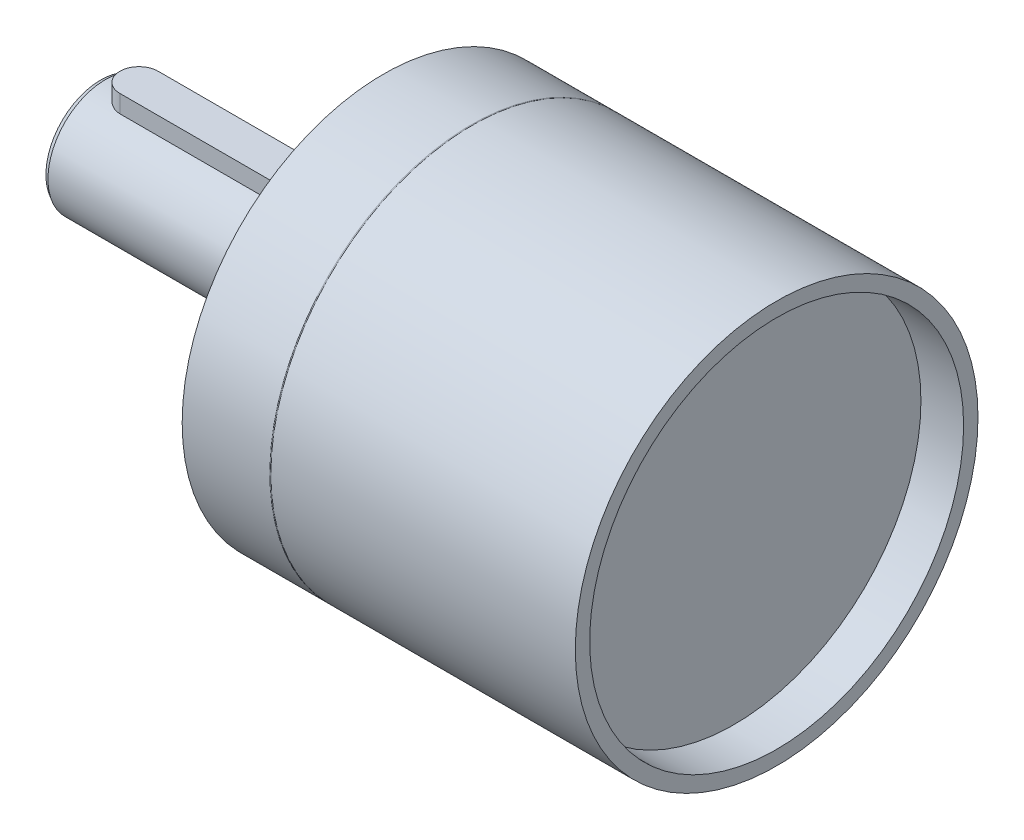
ISO-10303-21;
HEADER;
FILE_DESCRIPTION(('STEP AP214'),'2;1');
FILE_NAME('part.step','',(''),(''),'','','');
FILE_SCHEMA(('AUTOMOTIVE_DESIGN { 1 0 10303 214 1 1 1 1 }'));
ENDSEC;
DATA;
#1=APPLICATION_CONTEXT('core data for automotive mechanical design processes');
#2=APPLICATION_PROTOCOL_DEFINITION('international standard','automotive_design',2000,#1);
#3=PRODUCT_CONTEXT('',#1,'mechanical');
#4=PRODUCT('Part','Part','',(#3));
#5=PRODUCT_RELATED_PRODUCT_CATEGORY('part','',(#4));
#6=PRODUCT_DEFINITION_FORMATION('','',#4);
#7=PRODUCT_DEFINITION_CONTEXT('part definition',#1,'design');
#8=PRODUCT_DEFINITION('design','',#6,#7);
#9=PRODUCT_DEFINITION_SHAPE('','',#8);
#10=(LENGTH_UNIT() NAMED_UNIT(*) SI_UNIT(.MILLI.,.METRE.));
#11=(NAMED_UNIT(*) PLANE_ANGLE_UNIT() SI_UNIT($,.RADIAN.));
#12=(NAMED_UNIT(*) SI_UNIT($,.STERADIAN.) SOLID_ANGLE_UNIT());
#13=UNCERTAINTY_MEASURE_WITH_UNIT(LENGTH_MEASURE(1.E-05),#10,'distance_accuracy_value','');
#14=(GEOMETRIC_REPRESENTATION_CONTEXT(3) GLOBAL_UNCERTAINTY_ASSIGNED_CONTEXT((#13)) GLOBAL_UNIT_ASSIGNED_CONTEXT((#10,
#11,#12)) REPRESENTATION_CONTEXT('',''));
#15=CARTESIAN_POINT('',(0.,0.,0.));
#16=DIRECTION('',(0.,0.,1.));
#17=DIRECTION('',(1.,0.,0.));
#18=AXIS2_PLACEMENT_3D('',#15,#16,#17);
#19=CARTESIAN_POINT('',(-27.560843918252,0.,0.));
#20=DIRECTION('',(-1.,0.,0.));
#21=DIRECTION('',(0.,0.,1.));
#22=AXIS2_PLACEMENT_3D('',#19,#20,#21);
#23=CONICAL_SURFACE('',#22,0.624999999956799,1.04719755117749);
#24=CARTESIAN_POINT('',(-27.56084391824,0.,0.));
#25=DIRECTION('',(-1.,0.,0.));
#26=DIRECTION('',(0.,0.,1.));
#27=AXIS2_PLACEMENT_3D('',#24,#25,#26);
#28=CIRCLE('',#27,0.625);
#29=CARTESIAN_POINT('',(-27.56084391824,0.,0.625));
#30=VERTEX_POINT('',#29);
#31=EDGE_CURVE('E148',#30,#30,#28,.T.);
#32=ORIENTED_EDGE('',*,*,#31,.T.);
#33=EDGE_LOOP('',(#32));
#34=FACE_BOUND('',#33,.T.);
#35=CARTESIAN_POINT('',(-27.2000000000219,5.6843418860808E-11,0.));
#36=VERTEX_POINT('',#35);
#37=VERTEX_LOOP('',#36);
#38=FACE_BOUND('',#37,.T.);
#39=ADVANCED_FACE('F17',(#34,#38),#23,.F.);
#40=CARTESIAN_POINT('',(-27.085,0.,0.));
#41=DIRECTION('',(-1.,0.,0.));
#42=DIRECTION('',(0.,0.,1.));
#43=AXIS2_PLACEMENT_3D('',#40,#41,#42);
#44=CYLINDRICAL_SURFACE('',#43,0.625);
#45=CARTESIAN_POINT('',(-28.2875644346632,0.,0.));
#46=DIRECTION('',(-1.,0.,0.));
#47=DIRECTION('',(0.,1.,0.));
#48=AXIS2_PLACEMENT_3D('',#45,#46,#47);
#49=CIRCLE('',#48,0.625000000013642);
#50=CARTESIAN_POINT('',(-28.2875644346632,0.625000000013642,0.));
#51=VERTEX_POINT('',#50);
#52=EDGE_CURVE('E144',#51,#51,#49,.T.);
#53=ORIENTED_EDGE('',*,*,#52,.T.);
#54=EDGE_LOOP('',(#53));
#55=FACE_BOUND('',#54,.T.);
#56=ORIENTED_EDGE('',*,*,#31,.F.);
#57=EDGE_LOOP('',(#56));
#58=FACE_BOUND('',#57,.T.);
#59=ADVANCED_FACE('F661',(#55,#58),#44,.F.);
#60=CARTESIAN_POINT('',(-29.4999999999845,0.,0.));
#61=DIRECTION('',(-1.,0.,0.));
#62=DIRECTION('',(0.,0.,1.));
#63=AXIS2_PLACEMENT_3D('',#60,#61,#62);
#64=CONICAL_SURFACE('',#63,1.32500000000846,0.523598775586827);
#65=ORIENTED_EDGE('',*,*,#52,.F.);
#66=EDGE_LOOP('',(#65));
#67=FACE_BOUND('',#66,.T.);
#68=CARTESIAN_POINT('',(-29.4999999999845,0.,0.));
#69=DIRECTION('',(-1.,0.,0.));
#70=DIRECTION('',(0.,0.,1.));
#71=AXIS2_PLACEMENT_3D('',#68,#69,#70);
#72=CIRCLE('',#71,1.32500000000846);
#73=CARTESIAN_POINT('',(-29.4999999999845,0.,1.32500000000846));
#74=VERTEX_POINT('',#73);
#75=EDGE_CURVE('E20',#74,#74,#72,.T.);
#76=ORIENTED_EDGE('',*,*,#75,.T.);
#77=EDGE_LOOP('',(#76));
#78=FACE_BOUND('',#77,.T.);
#79=ADVANCED_FACE('F653',(#67,#78),#64,.F.);
#80=CARTESIAN_POINT('',(0.,7.5,0.));
#81=DIRECTION('',(0.,1.,0.));
#82=DIRECTION('',(0.,0.,1.));
#83=AXIS2_PLACEMENT_3D('',#80,#81,#82);
#84=PLANE('',#83);
#85=DIRECTION('',(-1.,0.,0.));
#86=VECTOR('',#85,1.);
#87=CARTESIAN_POINT('',(-9.5,7.5,-2.));
#88=LINE('',#87,#86);
#89=CARTESIAN_POINT('',(-25.5,7.5,-2.));
#90=VERTEX_POINT('',#89);
#91=CARTESIAN_POINT('',(-9.5,7.5,-2.));
#92=VERTEX_POINT('',#91);
#93=EDGE_CURVE('E106',#90,#92,#88,.F.);
#94=ORIENTED_EDGE('',*,*,#93,.F.);
#95=CARTESIAN_POINT('',(-25.5,7.5,0.));
#96=DIRECTION('',(0.,1.,0.));
#97=DIRECTION('',(0.,0.,1.));
#98=AXIS2_PLACEMENT_3D('',#95,#96,#97);
#99=CIRCLE('',#98,2.);
#100=CARTESIAN_POINT('',(-25.5,7.5,2.));
#101=VERTEX_POINT('',#100);
#102=EDGE_CURVE('E124',#101,#90,#99,.F.);
#103=ORIENTED_EDGE('',*,*,#102,.F.);
#104=DIRECTION('',(1.,0.,0.));
#105=VECTOR('',#104,1.);
#106=CARTESIAN_POINT('',(-25.5,7.5,2.));
#107=LINE('',#106,#105);
#108=CARTESIAN_POINT('',(-9.5,7.5,2.));
#109=VERTEX_POINT('',#108);
#110=EDGE_CURVE('E121',#109,#101,#107,.F.);
#111=ORIENTED_EDGE('',*,*,#110,.F.);
#112=CARTESIAN_POINT('',(-9.5,7.5,0.));
#113=DIRECTION('',(0.,1.,0.));
#114=DIRECTION('',(0.,0.,1.));
#115=AXIS2_PLACEMENT_3D('',#112,#113,#114);
#116=CIRCLE('',#115,2.);
#117=EDGE_CURVE('E111',#92,#109,#116,.F.);
#118=ORIENTED_EDGE('',*,*,#117,.F.);
#119=EDGE_LOOP('',(#94,#103,#111,#118));
#120=FACE_BOUND('',#119,.T.);
#121=ADVANCED_FACE('F122',(#120),#84,.T.);
#122=CARTESIAN_POINT('',(-29.5,0.,0.));
#123=DIRECTION('',(1.,0.,0.));
#124=DIRECTION('',(0.,0.,-1.));
#125=AXIS2_PLACEMENT_3D('',#122,#123,#124);
#126=PLANE('',#125);
#127=ORIENTED_EDGE('',*,*,#75,.F.);
#128=EDGE_LOOP('',(#127));
#129=FACE_BOUND('',#128,.T.);
#130=CARTESIAN_POINT('',(-29.4999999999845,0.,0.));
#131=DIRECTION('',(1.,0.,0.));
#132=DIRECTION('',(0.,0.,-1.));
#133=AXIS2_PLACEMENT_3D('',#130,#131,#132);
#134=CIRCLE('',#133,5.71132486546215);
#135=CARTESIAN_POINT('',(-29.4999999999845,0.,-5.71132486546215));
#136=VERTEX_POINT('',#135);
#137=EDGE_CURVE('E340',#136,#136,#134,.T.);
#138=ORIENTED_EDGE('',*,*,#137,.F.);
#139=EDGE_LOOP('',(#138));
#140=FACE_BOUND('',#139,.T.);
#141=ADVANCED_FACE('F637',(#129,#140),#126,.F.);
#142=CARTESIAN_POINT('',(-9.5,0.,-2.));
#143=DIRECTION('',(0.,0.,-1.));
#144=DIRECTION('',(-1.,0.,0.));
#145=AXIS2_PLACEMENT_3D('',#142,#143,#144);
#146=PLANE('',#145);
#147=DIRECTION('',(0.,1.,0.));
#148=VECTOR('',#147,1.);
#149=CARTESIAN_POINT('',(-9.5,0.,-2.));
#150=LINE('',#149,#148);
#151=CARTESIAN_POINT('',(-9.5,5.65685424949236,-2.00000000000003));
#152=VERTEX_POINT('',#151);
#153=EDGE_CURVE('E117',#152,#92,#150,.T.);
#154=ORIENTED_EDGE('',*,*,#153,.F.);
#155=DIRECTION('',(1.,0.,0.));
#156=VECTOR('',#155,1.);
#157=CARTESIAN_POINT('',(-29.50000001223,5.65685424949234,-2.00000000000012));
#158=LINE('',#157,#156);
#159=CARTESIAN_POINT('',(-25.5,5.65685424949236,-2.00000000000006));
#160=VERTEX_POINT('',#159);
#161=EDGE_CURVE('E335',#160,#152,#158,.T.);
#162=ORIENTED_EDGE('',*,*,#161,.F.);
#163=DIRECTION('',(0.,1.,0.));
#164=VECTOR('',#163,1.);
#165=CARTESIAN_POINT('',(-25.5,0.,-2.));
#166=LINE('',#165,#164);
#167=EDGE_CURVE('E346',#90,#160,#166,.F.);
#168=ORIENTED_EDGE('',*,*,#167,.F.);
#169=ORIENTED_EDGE('',*,*,#93,.T.);
#170=EDGE_LOOP('',(#154,#162,#168,#169));
#171=FACE_BOUND('',#170,.T.);
#172=ADVANCED_FACE('F630',(#171),#146,.T.);
#173=CARTESIAN_POINT('',(-9.5,0.,0.));
#174=DIRECTION('',(0.,1.,0.));
#175=DIRECTION('',(0.,0.,1.));
#176=AXIS2_PLACEMENT_3D('',#173,#174,#175);
#177=CYLINDRICAL_SURFACE('',#176,2.);
#178=DIRECTION('',(0.,1.,0.));
#179=VECTOR('',#178,1.);
#180=CARTESIAN_POINT('',(-9.5,0.,2.));
#181=LINE('',#180,#179);
#182=CARTESIAN_POINT('',(-9.5,5.65685424949236,2.00000000000006));
#183=VERTEX_POINT('',#182);
#184=EDGE_CURVE('E115',#183,#109,#181,.T.);
#185=ORIENTED_EDGE('',*,*,#184,.F.);
#186=CARTESIAN_POINT('',(-9.5,5.65685424949238,-2.));
#187=CARTESIAN_POINT('',(-9.44541895672399,5.65684884179147,-2.00000149375843));
#188=CARTESIAN_POINT('',(-9.39086577621134,5.65764520027124,-1.99776424451255));
#189=CARTESIAN_POINT('',(-9.28218263405823,5.66078655296455,-1.98885119435739));
#190=CARTESIAN_POINT('',(-9.22805256216313,5.66313112913611,-1.98217659159679));
#191=CARTESIAN_POINT('',(-9.06721552030273,5.67238186100911,-1.95562129980308));
#192=CARTESIAN_POINT('',(-8.96163821402684,5.68150585996212,-1.92920842248733));
#193=CARTESIAN_POINT('',(-8.75674813455779,5.70456166112212,-1.85991633491415));
#194=CARTESIAN_POINT('',(-8.65743203403455,5.7184908838253,-1.81704595785701));
#195=CARTESIAN_POINT('',(-8.46731769061003,5.74957624122923,-1.71614472563144));
#196=CARTESIAN_POINT('',(-8.37652447504903,5.76673426277569,-1.65810499804511));
#197=CARTESIAN_POINT('',(-8.20256728991935,5.80308799465943,-1.52610884181332));
#198=CARTESIAN_POINT('',(-8.11978479859934,5.8223341977329,-1.45166369414288));
#199=CARTESIAN_POINT('',(-7.96760004309403,5.86027369058979,-1.28999145201007));
#200=CARTESIAN_POINT('',(-7.89820250398592,5.87896678315314,-1.20275986280909));
#201=CARTESIAN_POINT('',(-7.77301185564616,5.91428598942568,-1.01516592788934));
#202=CARTESIAN_POINT('',(-7.71762776817957,5.93084424167128,-0.914516988771548));
#203=CARTESIAN_POINT('',(-7.62477936142906,5.95940326071059,-0.704746567262074));
#204=CARTESIAN_POINT('',(-7.58729305109839,5.97140961667465,-0.595635674808579));
#205=CARTESIAN_POINT('',(-7.53975245896824,5.98683877140557,-0.405040536436655));
#206=CARTESIAN_POINT('',(-7.52487607931098,5.99174657627998,-0.324846609487063));
#207=CARTESIAN_POINT('',(-7.50499841248844,5.99832834221426,-0.163111840880363));
#208=CARTESIAN_POINT('',(-7.49999657718262,6.00000248277623,-0.0815710742403429));
#209=CARTESIAN_POINT('',(-7.50000457598219,5.99999668076367,0.109052789280185));
#210=CARTESIAN_POINT('',(-7.50895512679546,5.99699670684629,0.218159747800598));
#211=CARTESIAN_POINT('',(-7.54443701920154,5.98531165061164,0.433213016519224));
#212=CARTESIAN_POINT('',(-7.57098331309363,5.97662173323895,0.539156558461215));
#213=CARTESIAN_POINT('',(-7.64064090432792,5.95450524812733,0.74466935491201));
#214=CARTESIAN_POINT('',(-7.68371928493169,5.94108809701936,0.84425082015528));
#215=CARTESIAN_POINT('',(-7.78508919594529,5.91088699350149,1.03476127570407));
#216=CARTESIAN_POINT('',(-7.84338193213425,5.89410277426667,1.12568957944319));
#217=CARTESIAN_POINT('',(-7.97564950070831,5.85828241386194,1.2994805717371));
#218=CARTESIAN_POINT('',(-8.05005745949872,5.8391922922297,1.38200242703585));
#219=CARTESIAN_POINT('',(-8.21152992750359,5.80120734240529,1.53366153903484));
#220=CARTESIAN_POINT('',(-8.29859794814308,5.78231256995809,1.60279506987144));
#221=CARTESIAN_POINT('',(-8.48600116281379,5.74626041003989,1.72767175144752));
#222=CARTESIAN_POINT('',(-8.58664859580632,5.72916954418608,1.78296692362324));
#223=CARTESIAN_POINT('',(-8.79643982540843,5.69949629987983,1.87566629037053));
#224=CARTESIAN_POINT('',(-8.90557492499725,5.68690937859231,1.91308852503714));
#225=CARTESIAN_POINT('',(-9.09599725860003,5.67072104665874,1.96044949514537));
#226=CARTESIAN_POINT('',(-9.17597609254467,5.66556318486903,1.97524301676809));
#227=CARTESIAN_POINT('',(-9.3372846305515,5.65861074103288,1.99503214763902));
#228=CARTESIAN_POINT('',(-9.41861445719262,5.6568164658732,2.00002686286613));
#229=CARTESIAN_POINT('',(-9.5,5.65685424949238,2.));
#230=B_SPLINE_CURVE_WITH_KNOTS('',3,(#186,#187,#188,#189,#190,#191,#192,#193,#194,#195,#196,
#197,#198,#199,#200,#201,#202,#203,#204,#205,#206,#207,#208,#209,#210,#211,#212,#213,#214,#215,
#216,#217,#218,#219,#220,#221,#222,#223,#224,#225,#226,#227,#228,#229),.UNSPECIFIED.,.F.,.F.,(4,
2,2,2,2,2,2,2,2,2,2,2,2,2,2,2,2,2,2,2,2,4),(0.,0.16363711848162,0.327230070545713,
0.653162397592184,0.97892003167861,1.30486862655436,1.64230066113897,1.9798515968479,
2.32634313894962,2.67240784330359,2.91690557900246,3.16138974213691,3.48824187903641,
3.81537212111244,4.14185437137159,4.46836250409951,4.80507367423102,5.14187841415668,
5.48847983044704,5.83473066046781,6.07859129287806,6.32247417355028),.UNSPECIFIED.);
#231=EDGE_CURVE('E239',#152,#183,#230,.T.);
#232=ORIENTED_EDGE('',*,*,#231,.F.);
#233=ORIENTED_EDGE('',*,*,#153,.T.);
#234=ORIENTED_EDGE('',*,*,#117,.T.);
#235=EDGE_LOOP('',(#185,#232,#233,#234));
#236=FACE_BOUND('',#235,.T.);
#237=ADVANCED_FACE('F113',(#236),#177,.T.);
#238=CARTESIAN_POINT('',(-25.5,0.,2.));
#239=DIRECTION('',(0.,0.,1.));
#240=DIRECTION('',(1.,0.,0.));
#241=AXIS2_PLACEMENT_3D('',#238,#239,#240);
#242=PLANE('',#241);
#243=DIRECTION('',(0.,1.,0.));
#244=VECTOR('',#243,1.);
#245=CARTESIAN_POINT('',(-25.5,0.,2.));
#246=LINE('',#245,#244);
#247=CARTESIAN_POINT('',(-25.5,5.65685424949236,2.00000000000003));
#248=VERTEX_POINT('',#247);
#249=EDGE_CURVE('E128',#248,#101,#246,.T.);
#250=ORIENTED_EDGE('',*,*,#249,.F.);
#251=DIRECTION('',(1.,0.,0.));
#252=VECTOR('',#251,1.);
#253=CARTESIAN_POINT('',(-29.50000001223,5.65685424949234,2.00000000000012));
#254=LINE('',#253,#252);
#255=EDGE_CURVE('E132',#183,#248,#254,.F.);
#256=ORIENTED_EDGE('',*,*,#255,.F.);
#257=ORIENTED_EDGE('',*,*,#184,.T.);
#258=ORIENTED_EDGE('',*,*,#110,.T.);
#259=EDGE_LOOP('',(#250,#256,#257,#258));
#260=FACE_BOUND('',#259,.T.);
#261=ADVANCED_FACE('F130',(#260),#242,.T.);
#262=CARTESIAN_POINT('',(-25.5,0.,0.));
#263=DIRECTION('',(0.,1.,0.));
#264=DIRECTION('',(0.,0.,1.));
#265=AXIS2_PLACEMENT_3D('',#262,#263,#264);
#266=CYLINDRICAL_SURFACE('',#265,2.);
#267=ORIENTED_EDGE('',*,*,#167,.T.);
#268=CARTESIAN_POINT('',(-25.5,5.65685424949238,2.));
#269=CARTESIAN_POINT('',(-25.554581043276,5.65684884179147,2.00000149375843));
#270=CARTESIAN_POINT('',(-25.6091342237887,5.65764520027124,1.99776424451255));
#271=CARTESIAN_POINT('',(-25.7178173659418,5.66078655296455,1.98885119435739));
#272=CARTESIAN_POINT('',(-25.7719474378369,5.66313112913611,1.98217659159679));
#273=CARTESIAN_POINT('',(-25.9327844796973,5.67238186100911,1.95562129980308));
#274=CARTESIAN_POINT('',(-26.0383617859732,5.68150585996212,1.92920842248733));
#275=CARTESIAN_POINT('',(-26.2432518654422,5.70456166112212,1.85991633491415));
#276=CARTESIAN_POINT('',(-26.3425679659655,5.7184908838253,1.81704595785701));
#277=CARTESIAN_POINT('',(-26.53268230939,5.74957624122923,1.71614472563143));
#278=CARTESIAN_POINT('',(-26.623475524951,5.76673426277569,1.65810499804511));
#279=CARTESIAN_POINT('',(-26.7974327100807,5.80308799465944,1.52610884181332));
#280=CARTESIAN_POINT('',(-26.8802152014007,5.8223341977329,1.45166369414288));
#281=CARTESIAN_POINT('',(-27.032399956906,5.86027369058979,1.28999145201007));
#282=CARTESIAN_POINT('',(-27.1017974960141,5.87896678315314,1.20275986280909));
#283=CARTESIAN_POINT('',(-27.2269881443538,5.91428598942568,1.01516592788933));
#284=CARTESIAN_POINT('',(-27.2823722318204,5.93084424167127,0.914516988771545));
#285=CARTESIAN_POINT('',(-27.3752206385709,5.95940326071059,0.70474656726207));
#286=CARTESIAN_POINT('',(-27.4127069489016,5.97140961667465,0.595635674808576));
#287=CARTESIAN_POINT('',(-27.4602475410318,5.98683877140557,0.405040536436653));
#288=CARTESIAN_POINT('',(-27.475123920689,5.99174657627998,0.32484660948706));
#289=CARTESIAN_POINT('',(-27.4950015875116,5.99832834221426,0.163111840880361));
#290=CARTESIAN_POINT('',(-27.5000034228174,6.00000248277623,0.0815710742403417));
#291=CARTESIAN_POINT('',(-27.4999954240178,5.99999668076367,-0.109052789280186));
#292=CARTESIAN_POINT('',(-27.4910448732045,5.99699670684629,-0.218159747800598));
#293=CARTESIAN_POINT('',(-27.4555629807985,5.98531165061164,-0.433213016519224));
#294=CARTESIAN_POINT('',(-27.4290166869064,5.97662173323895,-0.539156558461215));
#295=CARTESIAN_POINT('',(-27.3593590956721,5.95450524812733,-0.74466935491201));
#296=CARTESIAN_POINT('',(-27.3162807150683,5.94108809701936,-0.844250820155281));
#297=CARTESIAN_POINT('',(-27.2149108040547,5.91088699350149,-1.03476127570407));
#298=CARTESIAN_POINT('',(-27.1566180678657,5.89410277426667,-1.12568957944319));
#299=CARTESIAN_POINT('',(-27.0243504992917,5.85828241386194,-1.2994805717371));
#300=CARTESIAN_POINT('',(-26.9499425405013,5.8391922922297,-1.38200242703585));
#301=CARTESIAN_POINT('',(-26.7884700724964,5.80120734240529,-1.53366153903484));
#302=CARTESIAN_POINT('',(-26.7014020518569,5.78231256995809,-1.60279506987144));
#303=CARTESIAN_POINT('',(-26.5139988371862,5.74626041003989,-1.72767175144752));
#304=CARTESIAN_POINT('',(-26.4133514041937,5.72916954418608,-1.78296692362324));
#305=CARTESIAN_POINT('',(-26.2035601745916,5.69949629987983,-1.87566629037053));
#306=CARTESIAN_POINT('',(-26.0944250750028,5.68690937859231,-1.91308852503714));
#307=CARTESIAN_POINT('',(-25.9040027414,5.67072104665874,-1.96044949514537));
#308=CARTESIAN_POINT('',(-25.8240239074553,5.66556318486903,-1.97524301676809));
#309=CARTESIAN_POINT('',(-25.6627153694485,5.65861074103288,-1.99503214763902));
#310=CARTESIAN_POINT('',(-25.5813855428074,5.6568164658732,-2.00002686286613));
#311=CARTESIAN_POINT('',(-25.5,5.65685424949238,-2.));
#312=B_SPLINE_CURVE_WITH_KNOTS('',3,(#268,#269,#270,#271,#272,#273,#274,#275,#276,#277,#278,
#279,#280,#281,#282,#283,#284,#285,#286,#287,#288,#289,#290,#291,#292,#293,#294,#295,#296,#297,
#298,#299,#300,#301,#302,#303,#304,#305,#306,#307,#308,#309,#310,#311),.UNSPECIFIED.,.F.,.F.,(4,
2,2,2,2,2,2,2,2,2,2,2,2,2,2,2,2,2,2,2,2,4),(0.,0.16363711848162,0.327230070545711,
0.653162397592184,0.978920031678615,1.30486862655436,1.64230066113898,1.9798515968479,
2.32634313894963,2.67240784330359,2.91690557900246,3.16138974213691,3.4882418790364,
3.81537212111244,4.14185437137159,4.46836250409951,4.80507367423102,5.14187841415668,
5.48847983044704,5.83473066046781,6.07859129287806,6.32247417355027),.UNSPECIFIED.);
#313=EDGE_CURVE('E230',#248,#160,#312,.T.);
#314=ORIENTED_EDGE('',*,*,#313,.F.);
#315=ORIENTED_EDGE('',*,*,#249,.T.);
#316=ORIENTED_EDGE('',*,*,#102,.T.);
#317=EDGE_LOOP('',(#267,#314,#315,#316));
#318=FACE_BOUND('',#317,.T.);
#319=ADVANCED_FACE('F245',(#318),#266,.T.);
#320=CARTESIAN_POINT('',(-29.0000000002237,0.,0.));
#321=DIRECTION('',(1.,0.,0.));
#322=DIRECTION('',(0.,0.,-1.));
#323=AXIS2_PLACEMENT_3D('',#320,#321,#322);
#324=CONICAL_SURFACE('',#323,5.99999999991496,0.523598775592442);
#325=CARTESIAN_POINT('',(-29.,0.,0.));
#326=DIRECTION('',(1.,0.,0.));
#327=DIRECTION('',(0.,0.,-1.));
#328=AXIS2_PLACEMENT_3D('',#325,#326,#327);
#329=CIRCLE('',#328,6.);
#330=CARTESIAN_POINT('',(-29.,0.,-6.));
#331=VERTEX_POINT('',#330);
#332=EDGE_CURVE('E238',#331,#331,#329,.T.);
#333=ORIENTED_EDGE('',*,*,#332,.F.);
#334=EDGE_LOOP('',(#333));
#335=FACE_BOUND('',#334,.T.);
#336=ORIENTED_EDGE('',*,*,#137,.T.);
#337=EDGE_LOOP('',(#336));
#338=FACE_BOUND('',#337,.T.);
#339=ADVANCED_FACE('F254',(#335,#338),#324,.T.);
#340=CARTESIAN_POINT('',(-29.50000001223,0.,0.));
#341=DIRECTION('',(1.,0.,0.));
#342=DIRECTION('',(0.,0.,-1.));
#343=AXIS2_PLACEMENT_3D('',#340,#341,#342);
#344=CYLINDRICAL_SURFACE('',#343,6.);
#345=DIRECTION('',(1.,0.,0.));
#346=VECTOR('',#345,1.);
#347=CARTESIAN_POINT('',(-29.50000001223,-5.99279677762809,-0.293916284085002));
#348=LINE('',#347,#346);
#349=CARTESIAN_POINT('',(-4.,-5.99279677762809,-0.293916284085001));
#350=VERTEX_POINT('',#349);
#351=CARTESIAN_POINT('',(-3.,-5.99279677762809,-0.293916284085001));
#352=VERTEX_POINT('',#351);
#353=EDGE_CURVE('E339',#350,#352,#348,.T.);
#354=ORIENTED_EDGE('',*,*,#353,.T.);
#355=CARTESIAN_POINT('',(-3.,0.,0.));
#356=DIRECTION('',(1.,0.,0.));
#357=DIRECTION('',(0.,0.,-1.));
#358=AXIS2_PLACEMENT_3D('',#355,#356,#357);
#359=CIRCLE('',#358,6.);
#360=CARTESIAN_POINT('',(-3.,-5.99279677762809,0.293916284085002));
#361=VERTEX_POINT('',#360);
#362=EDGE_CURVE('E334',#352,#361,#359,.F.);
#363=ORIENTED_EDGE('',*,*,#362,.T.);
#364=DIRECTION('',(1.,0.,0.));
#365=VECTOR('',#364,1.);
#366=CARTESIAN_POINT('',(-29.50000001223,-5.99279677762809,0.293916284085004));
#367=LINE('',#366,#365);
#368=CARTESIAN_POINT('',(-4.,-5.99279677762809,0.293916284085002));
#369=VERTEX_POINT('',#368);
#370=EDGE_CURVE('E331',#361,#369,#367,.F.);
#371=ORIENTED_EDGE('',*,*,#370,.T.);
#372=CARTESIAN_POINT('',(-4.,0.,0.));
#373=DIRECTION('',(1.,0.,0.));
#374=DIRECTION('',(0.,0.,-1.));
#375=AXIS2_PLACEMENT_3D('',#372,#373,#374);
#376=CIRCLE('',#375,6.);
#377=EDGE_CURVE('E225',#350,#369,#376,.T.);
#378=ORIENTED_EDGE('',*,*,#377,.F.);
#379=EDGE_LOOP('',(#354,#363,#371,#378));
#380=FACE_BOUND('',#379,.T.);
#381=ORIENTED_EDGE('',*,*,#161,.T.);
#382=ORIENTED_EDGE('',*,*,#231,.T.);
#383=ORIENTED_EDGE('',*,*,#255,.T.);
#384=ORIENTED_EDGE('',*,*,#313,.T.);
#385=EDGE_LOOP('',(#381,#382,#383,#384));
#386=FACE_BOUND('',#385,.T.);
#387=ORIENTED_EDGE('',*,*,#332,.T.);
#388=EDGE_LOOP('',(#387));
#389=FACE_BOUND('',#388,.T.);
#390=ADVANCED_FACE('F249',(#380,#386,#389),#344,.T.);
#391=CARTESIAN_POINT('',(-4.,0.,0.));
#392=DIRECTION('',(-1.,0.,0.));
#393=DIRECTION('',(0.,0.,1.));
#394=AXIS2_PLACEMENT_3D('',#391,#392,#393);
#395=PLANE('',#394);
#396=DIRECTION('',(0.,1.,0.));
#397=VECTOR('',#396,1.);
#398=CARTESIAN_POINT('',(-4.,0.,-0.293916284085));
#399=LINE('',#398,#397);
#400=CARTESIAN_POINT('',(-4.,-7.61683878137722,-0.293916284085));
#401=VERTEX_POINT('',#400);
#402=EDGE_CURVE('E229',#401,#350,#399,.T.);
#403=ORIENTED_EDGE('',*,*,#402,.T.);
#404=ORIENTED_EDGE('',*,*,#377,.T.);
#405=DIRECTION('',(0.,1.,0.));
#406=VECTOR('',#405,1.);
#407=CARTESIAN_POINT('',(-4.,-5.992796777628,0.293916284085));
#408=LINE('',#407,#406);
#409=CARTESIAN_POINT('',(-4.,-7.616838781378,0.293916284085));
#410=VERTEX_POINT('',#409);
#411=EDGE_CURVE('E224',#410,#369,#408,.T.);
#412=ORIENTED_EDGE('',*,*,#411,.F.);
#413=CARTESIAN_POINT('',(-4.,-4.741805259079,0.293916284085));
#414=DIRECTION('',(-1.,0.,0.));
#415=DIRECTION('',(0.,0.,1.));
#416=AXIS2_PLACEMENT_3D('',#413,#414,#415);
#417=CIRCLE('',#416,2.875033522299);
#418=CARTESIAN_POINT('',(-4.,-5.99279677762795,2.8825139690992));
#419=VERTEX_POINT('',#418);
#420=EDGE_CURVE('E220',#419,#410,#417,.F.);
#421=ORIENTED_EDGE('',*,*,#420,.F.);
#422=CARTESIAN_POINT('',(-4.,0.,0.));
#423=DIRECTION('',(-1.,0.,0.));
#424=DIRECTION('',(0.,0.,1.));
#425=AXIS2_PLACEMENT_3D('',#422,#423,#424);
#426=CIRCLE('',#425,6.65);
#427=CARTESIAN_POINT('',(-4.,-5.99279677762801,-2.88251396909922));
#428=VERTEX_POINT('',#427);
#429=EDGE_CURVE('E215',#428,#419,#426,.F.);
#430=ORIENTED_EDGE('',*,*,#429,.F.);
#431=CARTESIAN_POINT('',(-4.,-3.804845487331,0.293916284085));
#432=DIRECTION('',(-1.,0.,0.));
#433=DIRECTION('',(0.,0.,1.));
#434=AXIS2_PLACEMENT_3D('',#431,#432,#433);
#435=CIRCLE('',#434,3.857050686996);
#436=EDGE_CURVE('E209',#401,#428,#435,.F.);
#437=ORIENTED_EDGE('',*,*,#436,.F.);
#438=EDGE_LOOP('',(#403,#404,#412,#421,#430,#437));
#439=FACE_BOUND('',#438,.T.);
#440=ADVANCED_FACE('F253',(#439),#395,.T.);
#441=CARTESIAN_POINT('',(-3.,-5.992796777628,0.293916284085));
#442=DIRECTION('',(0.,0.,-1.));
#443=DIRECTION('',(-1.,0.,0.));
#444=AXIS2_PLACEMENT_3D('',#441,#442,#443);
#445=PLANE('',#444);
#446=ORIENTED_EDGE('',*,*,#370,.F.);
#447=DIRECTION('',(0.,1.,0.));
#448=VECTOR('',#447,1.);
#449=CARTESIAN_POINT('',(-3.,0.,0.293916284085));
#450=LINE('',#449,#448);
#451=CARTESIAN_POINT('',(-3.,-7.616838781378,0.293916284085));
#452=VERTEX_POINT('',#451);
#453=EDGE_CURVE('E208',#361,#452,#450,.F.);
#454=ORIENTED_EDGE('',*,*,#453,.T.);
#455=DIRECTION('',(-1.,0.,0.));
#456=VECTOR('',#455,1.);
#457=CARTESIAN_POINT('',(-3.,-7.616838781378,0.293916284084999));
#458=LINE('',#457,#456);
#459=EDGE_CURVE('E219',#410,#452,#458,.F.);
#460=ORIENTED_EDGE('',*,*,#459,.F.);
#461=ORIENTED_EDGE('',*,*,#411,.T.);
#462=EDGE_LOOP('',(#446,#454,#460,#461));
#463=FACE_BOUND('',#462,.T.);
#464=ADVANCED_FACE('F383',(#463),#445,.T.);
#465=CARTESIAN_POINT('',(-3.,-4.741805259079,0.293916284085));
#466=DIRECTION('',(-1.,0.,0.));
#467=DIRECTION('',(0.,0.,1.));
#468=AXIS2_PLACEMENT_3D('',#465,#466,#467);
#469=CYLINDRICAL_SURFACE('',#468,2.875033522299);
#470=ORIENTED_EDGE('',*,*,#459,.T.);
#471=CARTESIAN_POINT('',(-3.,-4.741805259079,0.293916284085));
#472=DIRECTION('',(-1.,0.,0.));
#473=DIRECTION('',(0.,0.,1.));
#474=AXIS2_PLACEMENT_3D('',#471,#472,#473);
#475=CIRCLE('',#474,2.875033522299);
#476=CARTESIAN_POINT('',(-3.,-5.99279677762795,2.8825139690992));
#477=VERTEX_POINT('',#476);
#478=EDGE_CURVE('E205',#452,#477,#475,.T.);
#479=ORIENTED_EDGE('',*,*,#478,.T.);
#480=DIRECTION('',(-1.,0.,0.));
#481=VECTOR('',#480,1.);
#482=CARTESIAN_POINT('',(-3.,-5.99279677762804,2.88251396909902));
#483=LINE('',#482,#481);
#484=EDGE_CURVE('E214',#419,#477,#483,.F.);
#485=ORIENTED_EDGE('',*,*,#484,.F.);
#486=ORIENTED_EDGE('',*,*,#420,.T.);
#487=EDGE_LOOP('',(#470,#479,#485,#486));
#488=FACE_BOUND('',#487,.T.);
#489=ADVANCED_FACE('F380',(#488),#469,.T.);
#490=CARTESIAN_POINT('',(-3.,0.,0.));
#491=DIRECTION('',(-1.,0.,0.));
#492=DIRECTION('',(0.,0.,1.));
#493=AXIS2_PLACEMENT_3D('',#490,#491,#492);
#494=CYLINDRICAL_SURFACE('',#493,6.65);
#495=ORIENTED_EDGE('',*,*,#484,.T.);
#496=CARTESIAN_POINT('',(-3.,0.,0.));
#497=DIRECTION('',(-1.,0.,0.));
#498=DIRECTION('',(0.,0.,1.));
#499=AXIS2_PLACEMENT_3D('',#496,#497,#498);
#500=CIRCLE('',#499,6.65);
#501=CARTESIAN_POINT('',(-3.,-5.99279677762801,-2.88251396909922));
#502=VERTEX_POINT('',#501);
#503=EDGE_CURVE('E202',#477,#502,#500,.T.);
#504=ORIENTED_EDGE('',*,*,#503,.T.);
#505=DIRECTION('',(-1.,0.,0.));
#506=VECTOR('',#505,1.);
#507=CARTESIAN_POINT('',(-3.,-5.99279677762811,-2.88251396909915));
#508=LINE('',#507,#506);
#509=EDGE_CURVE('E213',#428,#502,#508,.F.);
#510=ORIENTED_EDGE('',*,*,#509,.F.);
#511=ORIENTED_EDGE('',*,*,#429,.T.);
#512=EDGE_LOOP('',(#495,#504,#510,#511));
#513=FACE_BOUND('',#512,.T.);
#514=ADVANCED_FACE('F377',(#513),#494,.T.);
#515=CARTESIAN_POINT('',(-3.,-3.804845487331,0.293916284085));
#516=DIRECTION('',(-1.,0.,0.));
#517=DIRECTION('',(0.,0.,1.));
#518=AXIS2_PLACEMENT_3D('',#515,#516,#517);
#519=CYLINDRICAL_SURFACE('',#518,3.857050686996);
#520=ORIENTED_EDGE('',*,*,#509,.T.);
#521=CARTESIAN_POINT('',(-3.,-3.804845487331,0.293916284085));
#522=DIRECTION('',(-1.,0.,0.));
#523=DIRECTION('',(0.,0.,1.));
#524=AXIS2_PLACEMENT_3D('',#521,#522,#523);
#525=CIRCLE('',#524,3.857050686996);
#526=CARTESIAN_POINT('',(-3.,-7.61683878137722,-0.293916284085));
#527=VERTEX_POINT('',#526);
#528=EDGE_CURVE('E199',#502,#527,#525,.T.);
#529=ORIENTED_EDGE('',*,*,#528,.T.);
#530=DIRECTION('',(1.,0.,0.));
#531=VECTOR('',#530,1.);
#532=CARTESIAN_POINT('',(-3.,-7.616838781377,-0.293916284085));
#533=LINE('',#532,#531);
#534=EDGE_CURVE('E310',#401,#527,#533,.T.);
#535=ORIENTED_EDGE('',*,*,#534,.F.);
#536=ORIENTED_EDGE('',*,*,#436,.T.);
#537=EDGE_LOOP('',(#520,#529,#535,#536));
#538=FACE_BOUND('',#537,.T.);
#539=ADVANCED_FACE('F373',(#538),#519,.T.);
#540=CARTESIAN_POINT('',(-3.,-7.616838781377,-0.293916284085));
#541=DIRECTION('',(0.,0.,1.));
#542=DIRECTION('',(1.,0.,0.));
#543=AXIS2_PLACEMENT_3D('',#540,#541,#542);
#544=PLANE('',#543);
#545=ORIENTED_EDGE('',*,*,#534,.T.);
#546=DIRECTION('',(0.,1.,0.));
#547=VECTOR('',#546,1.);
#548=CARTESIAN_POINT('',(-3.,0.,-0.293916284085));
#549=LINE('',#548,#547);
#550=EDGE_CURVE('E198',#527,#352,#549,.T.);
#551=ORIENTED_EDGE('',*,*,#550,.T.);
#552=ORIENTED_EDGE('',*,*,#353,.F.);
#553=ORIENTED_EDGE('',*,*,#402,.F.);
#554=EDGE_LOOP('',(#545,#551,#552,#553));
#555=FACE_BOUND('',#554,.T.);
#556=ADVANCED_FACE('F369',(#555),#544,.T.);
#557=CARTESIAN_POINT('',(-3.,0.,0.));
#558=DIRECTION('',(1.,0.,0.));
#559=DIRECTION('',(0.,0.,-1.));
#560=AXIS2_PLACEMENT_3D('',#557,#558,#559);
#561=PLANE('',#560);
#562=ORIENTED_EDGE('',*,*,#362,.F.);
#563=ORIENTED_EDGE('',*,*,#550,.F.);
#564=ORIENTED_EDGE('',*,*,#528,.F.);
#565=ORIENTED_EDGE('',*,*,#503,.F.);
#566=ORIENTED_EDGE('',*,*,#478,.F.);
#567=ORIENTED_EDGE('',*,*,#453,.F.);
#568=EDGE_LOOP('',(#562,#563,#564,#565,#566,#567));
#569=FACE_BOUND('',#568,.T.);
#570=CARTESIAN_POINT('',(-3.,0.,0.));
#571=DIRECTION('',(1.,0.,0.));
#572=DIRECTION('',(0.,0.,-1.));
#573=AXIS2_PLACEMENT_3D('',#570,#571,#572);
#574=CIRCLE('',#573,14.);
#575=CARTESIAN_POINT('',(-3.,0.,-14.));
#576=VERTEX_POINT('',#575);
#577=EDGE_CURVE('E193',#576,#576,#574,.T.);
#578=ORIENTED_EDGE('',*,*,#577,.F.);
#579=EDGE_LOOP('',(#578));
#580=FACE_BOUND('',#579,.T.);
#581=ADVANCED_FACE('F364',(#569,#580),#561,.F.);
#582=CARTESIAN_POINT('',(5.99999999997181,17.49999999997,3.054326190989E-05));
#583=DIRECTION('',(-1.,0.,0.));
#584=DIRECTION('',(0.,0.,1.));
#585=AXIS2_PLACEMENT_3D('',#582,#583,#584);
#586=CONICAL_SURFACE('',#585,1.6499999999978,1.02974425866086);
#587=CARTESIAN_POINT('',(6.,17.49999999997,3.054326190989E-05));
#588=DIRECTION('',(-1.,0.,0.));
#589=DIRECTION('',(0.,0.,1.));
#590=AXIS2_PLACEMENT_3D('',#587,#588,#589);
#591=CIRCLE('',#590,1.65);
#592=CARTESIAN_POINT('',(6.,17.49999999997,1.65003054326191));
#593=VERTEX_POINT('',#592);
#594=EDGE_CURVE('E197',#593,#593,#591,.T.);
#595=ORIENTED_EDGE('',*,*,#594,.T.);
#596=EDGE_LOOP('',(#595));
#597=FACE_BOUND('',#596,.T.);
#598=CARTESIAN_POINT('',(6.99142002136455,17.5000000000125,3.054326190989E-05));
#599=VERTEX_POINT('',#598);
#600=VERTEX_LOOP('',#599);
#601=FACE_BOUND('',#600,.T.);
#602=ADVANCED_FACE('F402',(#597,#601),#586,.F.);
#603=CARTESIAN_POINT('',(5.99999999997181,-3.054326190881E-05,17.49999999997));
#604=DIRECTION('',(-1.,0.,0.));
#605=DIRECTION('',(0.,0.,1.));
#606=AXIS2_PLACEMENT_3D('',#603,#604,#605);
#607=CONICAL_SURFACE('',#606,1.6499999999978,1.02974425866086);
#608=CARTESIAN_POINT('',(6.,-3.054326190881E-05,17.49999999997));
#609=DIRECTION('',(-1.,0.,0.));
#610=DIRECTION('',(0.,0.,1.));
#611=AXIS2_PLACEMENT_3D('',#608,#609,#610);
#612=CIRCLE('',#611,1.65);
#613=CARTESIAN_POINT('',(6.,-3.054326190881E-05,19.14999999997));
#614=VERTEX_POINT('',#613);
#615=EDGE_CURVE('E298',#614,#614,#612,.T.);
#616=ORIENTED_EDGE('',*,*,#615,.T.);
#617=EDGE_LOOP('',(#616));
#618=FACE_BOUND('',#617,.T.);
#619=CARTESIAN_POINT('',(6.99142002136455,-3.054326190881E-05,17.5000000000125));
#620=VERTEX_POINT('',#619);
#621=VERTEX_LOOP('',#620);
#622=FACE_BOUND('',#621,.T.);
#623=ADVANCED_FACE('F405',(#618,#622),#607,.F.);
#624=CARTESIAN_POINT('',(5.99999999997181,-17.49999999997,-3.054326190774E-05));
#625=DIRECTION('',(-1.,0.,0.));
#626=DIRECTION('',(0.,0.,1.));
#627=AXIS2_PLACEMENT_3D('',#624,#625,#626);
#628=CONICAL_SURFACE('',#627,1.6499999999978,1.02974425866086);
#629=CARTESIAN_POINT('',(6.,-17.49999999997,-3.054326190774E-05));
#630=DIRECTION('',(-1.,0.,0.));
#631=DIRECTION('',(0.,0.,1.));
#632=AXIS2_PLACEMENT_3D('',#629,#630,#631);
#633=CIRCLE('',#632,1.65);
#634=CARTESIAN_POINT('',(6.,-17.49999999997,1.64996945673809));
#635=VERTEX_POINT('',#634);
#636=EDGE_CURVE('E294',#635,#635,#633,.T.);
#637=ORIENTED_EDGE('',*,*,#636,.T.);
#638=EDGE_LOOP('',(#637));
#639=FACE_BOUND('',#638,.T.);
#640=CARTESIAN_POINT('',(6.99142002136455,-17.5000000000125,-3.054326190774E-05));
#641=VERTEX_POINT('',#640);
#642=VERTEX_LOOP('',#641);
#643=FACE_BOUND('',#642,.T.);
#644=ADVANCED_FACE('F409',(#639,#643),#628,.F.);
#645=CARTESIAN_POINT('',(5.99999999997181,3.054326190667E-05,-17.49999999997));
#646=DIRECTION('',(-1.,0.,0.));
#647=DIRECTION('',(0.,0.,1.));
#648=AXIS2_PLACEMENT_3D('',#645,#646,#647);
#649=CONICAL_SURFACE('',#648,1.6499999999978,1.02974425866086);
#650=CARTESIAN_POINT('',(6.,3.054326190667E-05,-17.49999999997));
#651=DIRECTION('',(-1.,0.,0.));
#652=DIRECTION('',(0.,0.,1.));
#653=AXIS2_PLACEMENT_3D('',#650,#651,#652);
#654=CIRCLE('',#653,1.65);
#655=CARTESIAN_POINT('',(6.,3.054326190667E-05,-15.84999999997));
#656=VERTEX_POINT('',#655);
#657=EDGE_CURVE('E290',#656,#656,#654,.T.);
#658=ORIENTED_EDGE('',*,*,#657,.T.);
#659=EDGE_LOOP('',(#658));
#660=FACE_BOUND('',#659,.T.);
#661=CARTESIAN_POINT('',(6.99142002136455,3.054326190667E-05,-17.5000000000125));
#662=VERTEX_POINT('',#661);
#663=VERTEX_LOOP('',#662);
#664=FACE_BOUND('',#663,.T.);
#665=ADVANCED_FACE('F413',(#660,#664),#649,.F.);
#666=CARTESIAN_POINT('',(2.00000000012324,18.01565088397,-7.462326931119));
#667=DIRECTION('',(-1.,0.,0.));
#668=DIRECTION('',(0.,0.,1.));
#669=AXIS2_PLACEMENT_3D('',#666,#667,#668);
#670=CONICAL_SURFACE('',#669,0.749999999922705,1.02974425868404);
#671=CARTESIAN_POINT('',(2.,18.01565088397,-7.462326931119));
#672=DIRECTION('',(-1.,0.,0.));
#673=DIRECTION('',(0.,0.,1.));
#674=AXIS2_PLACEMENT_3D('',#671,#672,#673);
#675=CIRCLE('',#674,0.75);
#676=CARTESIAN_POINT('',(2.,18.01565088397,-6.712326931119));
#677=VERTEX_POINT('',#676);
#678=EDGE_CURVE('E192',#677,#677,#675,.T.);
#679=ORIENTED_EDGE('',*,*,#678,.T.);
#680=EDGE_LOOP('',(#679));
#681=FACE_BOUND('',#680,.T.);
#682=CARTESIAN_POINT('',(2.45064546433582,18.0156508840241,-7.462326931119));
#683=VERTEX_POINT('',#682);
#684=VERTEX_LOOP('',#683);
#685=FACE_BOUND('',#684,.T.);
#686=ADVANCED_FACE('F417',(#681,#685),#670,.F.);
#687=CARTESIAN_POINT('',(-29.50000001223,0.,0.));
#688=DIRECTION('',(1.,0.,0.));
#689=DIRECTION('',(0.,0.,-1.));
#690=AXIS2_PLACEMENT_3D('',#687,#688,#689);
#691=CYLINDRICAL_SURFACE('',#690,14.);
#692=ORIENTED_EDGE('',*,*,#577,.T.);
#693=EDGE_LOOP('',(#692));
#694=FACE_BOUND('',#693,.T.);
#695=CARTESIAN_POINT('',(0.,0.,0.));
#696=DIRECTION('',(1.,0.,0.));
#697=DIRECTION('',(0.,0.,-1.));
#698=AXIS2_PLACEMENT_3D('',#695,#696,#697);
#699=CIRCLE('',#698,14.);
#700=CARTESIAN_POINT('',(0.,0.,-14.));
#701=VERTEX_POINT('',#700);
#702=EDGE_CURVE('E188',#701,#701,#699,.F.);
#703=ORIENTED_EDGE('',*,*,#702,.T.);
#704=EDGE_LOOP('',(#703));
#705=FACE_BOUND('',#704,.T.);
#706=ADVANCED_FACE('F421',(#694,#705),#691,.T.);
#707=CARTESIAN_POINT('',(7.340991022465,17.49999999997,3.054326190989E-05));
#708=DIRECTION('',(-1.,0.,0.));
#709=DIRECTION('',(0.,0.,1.));
#710=AXIS2_PLACEMENT_3D('',#707,#708,#709);
#711=CYLINDRICAL_SURFACE('',#710,1.65);
#712=ORIENTED_EDGE('',*,*,#594,.F.);
#713=EDGE_LOOP('',(#712));
#714=FACE_BOUND('',#713,.T.);
#715=CARTESIAN_POINT('',(0.,17.49999999997,3.054326190989E-05));
#716=DIRECTION('',(-1.,0.,0.));
#717=DIRECTION('',(0.,0.,1.));
#718=AXIS2_PLACEMENT_3D('',#715,#716,#717);
#719=CIRCLE('',#718,1.65);
#720=CARTESIAN_POINT('',(0.,17.49999999997,1.65003054326191));
#721=VERTEX_POINT('',#720);
#722=EDGE_CURVE('E184',#721,#721,#719,.T.);
#723=ORIENTED_EDGE('',*,*,#722,.T.);
#724=EDGE_LOOP('',(#723));
#725=FACE_BOUND('',#724,.T.);
#726=ADVANCED_FACE('F425',(#714,#725),#711,.F.);
#727=CARTESIAN_POINT('',(7.340991022465,-3.054326190881E-05,17.49999999997));
#728=DIRECTION('',(-1.,0.,0.));
#729=DIRECTION('',(0.,0.,1.));
#730=AXIS2_PLACEMENT_3D('',#727,#728,#729);
#731=CYLINDRICAL_SURFACE('',#730,1.65);
#732=ORIENTED_EDGE('',*,*,#615,.F.);
#733=EDGE_LOOP('',(#732));
#734=FACE_BOUND('',#733,.T.);
#735=CARTESIAN_POINT('',(0.,-3.054326190881E-05,17.49999999997));
#736=DIRECTION('',(-1.,0.,0.));
#737=DIRECTION('',(0.,0.,1.));
#738=AXIS2_PLACEMENT_3D('',#735,#736,#737);
#739=CIRCLE('',#738,1.65);
#740=CARTESIAN_POINT('',(0.,-3.054326190881E-05,19.14999999997));
#741=VERTEX_POINT('',#740);
#742=EDGE_CURVE('E180',#741,#741,#739,.T.);
#743=ORIENTED_EDGE('',*,*,#742,.T.);
#744=EDGE_LOOP('',(#743));
#745=FACE_BOUND('',#744,.T.);
#746=ADVANCED_FACE('F429',(#734,#745),#731,.F.);
#747=CARTESIAN_POINT('',(7.340991022465,-17.49999999997,-3.054326190774E-05));
#748=DIRECTION('',(-1.,0.,0.));
#749=DIRECTION('',(0.,0.,1.));
#750=AXIS2_PLACEMENT_3D('',#747,#748,#749);
#751=CYLINDRICAL_SURFACE('',#750,1.65);
#752=ORIENTED_EDGE('',*,*,#636,.F.);
#753=EDGE_LOOP('',(#752));
#754=FACE_BOUND('',#753,.T.);
#755=CARTESIAN_POINT('',(0.,-17.49999999997,-3.054326190774E-05));
#756=DIRECTION('',(-1.,0.,0.));
#757=DIRECTION('',(0.,0.,1.));
#758=AXIS2_PLACEMENT_3D('',#755,#756,#757);
#759=CIRCLE('',#758,1.65);
#760=CARTESIAN_POINT('',(0.,-17.49999999997,1.64996945673809));
#761=VERTEX_POINT('',#760);
#762=EDGE_CURVE('E176',#761,#761,#759,.T.);
#763=ORIENTED_EDGE('',*,*,#762,.T.);
#764=EDGE_LOOP('',(#763));
#765=FACE_BOUND('',#764,.T.);
#766=ADVANCED_FACE('F433',(#754,#765),#751,.F.);
#767=CARTESIAN_POINT('',(7.340991022465,3.054326190667E-05,-17.49999999997));
#768=DIRECTION('',(-1.,0.,0.));
#769=DIRECTION('',(0.,0.,1.));
#770=AXIS2_PLACEMENT_3D('',#767,#768,#769);
#771=CYLINDRICAL_SURFACE('',#770,1.65);
#772=ORIENTED_EDGE('',*,*,#657,.F.);
#773=EDGE_LOOP('',(#772));
#774=FACE_BOUND('',#773,.T.);
#775=CARTESIAN_POINT('',(0.,3.054326190667E-05,-17.49999999997));
#776=DIRECTION('',(-1.,0.,0.));
#777=DIRECTION('',(0.,0.,1.));
#778=AXIS2_PLACEMENT_3D('',#775,#776,#777);
#779=CIRCLE('',#778,1.65);
#780=CARTESIAN_POINT('',(0.,3.054326190667E-05,-15.84999999997));
#781=VERTEX_POINT('',#780);
#782=EDGE_CURVE('E172',#781,#781,#779,.T.);
#783=ORIENTED_EDGE('',*,*,#782,.T.);
#784=EDGE_LOOP('',(#783));
#785=FACE_BOUND('',#784,.T.);
#786=ADVANCED_FACE('F437',(#774,#785),#771,.F.);
#787=CARTESIAN_POINT('',(2.573177737484,18.01565088397,-7.462326931119));
#788=DIRECTION('',(-1.,0.,0.));
#789=DIRECTION('',(0.,0.,1.));
#790=AXIS2_PLACEMENT_3D('',#787,#788,#789);
#791=CYLINDRICAL_SURFACE('',#790,0.75);
#792=ORIENTED_EDGE('',*,*,#678,.F.);
#793=EDGE_LOOP('',(#792));
#794=FACE_BOUND('',#793,.T.);
#795=CARTESIAN_POINT('',(0.,18.01565088397,-7.462326931119));
#796=DIRECTION('',(-1.,0.,0.));
#797=DIRECTION('',(0.,0.,1.));
#798=AXIS2_PLACEMENT_3D('',#795,#796,#797);
#799=CIRCLE('',#798,0.75);
#800=CARTESIAN_POINT('',(0.,18.01565088397,-6.712326931119));
#801=VERTEX_POINT('',#800);
#802=EDGE_CURVE('E168',#801,#801,#799,.T.);
#803=ORIENTED_EDGE('',*,*,#802,.T.);
#804=EDGE_LOOP('',(#803));
#805=FACE_BOUND('',#804,.T.);
#806=ADVANCED_FACE('F441',(#794,#805),#791,.F.);
#807=CARTESIAN_POINT('',(36.55,0.,0.));
#808=DIRECTION('',(1.,0.,0.));
#809=DIRECTION('',(0.,0.,-1.));
#810=AXIS2_PLACEMENT_3D('',#807,#808,#809);
#811=PLANE('',#810);
#812=CARTESIAN_POINT('',(36.55,0.,0.));
#813=DIRECTION('',(1.,0.,0.));
#814=DIRECTION('',(0.,0.,-1.));
#815=AXIS2_PLACEMENT_3D('',#812,#813,#814);
#816=CIRCLE('',#815,19.5);
#817=CARTESIAN_POINT('',(36.55,0.,-19.5));
#818=VERTEX_POINT('',#817);
#819=EDGE_CURVE('E164',#818,#818,#816,.T.);
#820=ORIENTED_EDGE('',*,*,#819,.T.);
#821=EDGE_LOOP('',(#820));
#822=FACE_BOUND('',#821,.T.);
#823=ADVANCED_FACE('F445',(#822),#811,.T.);
#824=CARTESIAN_POINT('',(0.,0.,0.));
#825=DIRECTION('',(1.,0.,0.));
#826=DIRECTION('',(0.,0.,-1.));
#827=AXIS2_PLACEMENT_3D('',#824,#825,#826);
#828=PLANE('',#827);
#829=ORIENTED_EDGE('',*,*,#802,.F.);
#830=EDGE_LOOP('',(#829));
#831=FACE_BOUND('',#830,.T.);
#832=ORIENTED_EDGE('',*,*,#782,.F.);
#833=EDGE_LOOP('',(#832));
#834=FACE_BOUND('',#833,.T.);
#835=ORIENTED_EDGE('',*,*,#762,.F.);
#836=EDGE_LOOP('',(#835));
#837=FACE_BOUND('',#836,.T.);
#838=ORIENTED_EDGE('',*,*,#742,.F.);
#839=EDGE_LOOP('',(#838));
#840=FACE_BOUND('',#839,.T.);
#841=ORIENTED_EDGE('',*,*,#722,.F.);
#842=EDGE_LOOP('',(#841));
#843=FACE_BOUND('',#842,.T.);
#844=ORIENTED_EDGE('',*,*,#702,.F.);
#845=EDGE_LOOP('',(#844));
#846=FACE_BOUND('',#845,.T.);
#847=CARTESIAN_POINT('',(0.,0.,0.));
#848=DIRECTION('',(1.,0.,0.));
#849=DIRECTION('',(0.,0.,-1.));
#850=AXIS2_PLACEMENT_3D('',#847,#848,#849);
#851=CIRCLE('',#850,21.);
#852=CARTESIAN_POINT('',(0.,0.,-21.));
#853=VERTEX_POINT('',#852);
#854=EDGE_CURVE('E160',#853,#853,#851,.T.);
#855=ORIENTED_EDGE('',*,*,#854,.F.);
#856=EDGE_LOOP('',(#855));
#857=FACE_BOUND('',#856,.T.);
#858=ADVANCED_FACE('F449',(#831,#834,#837,#840,#843,#846,#857),#828,.F.);
#859=CARTESIAN_POINT('',(-29.50000001223,0.,0.));
#860=DIRECTION('',(1.,0.,0.));
#861=DIRECTION('',(0.,0.,-1.));
#862=AXIS2_PLACEMENT_3D('',#859,#860,#861);
#863=CYLINDRICAL_SURFACE('',#862,19.5);
#864=ORIENTED_EDGE('',*,*,#819,.F.);
#865=EDGE_LOOP('',(#864));
#866=FACE_BOUND('',#865,.T.);
#867=CARTESIAN_POINT('',(41.,0.,0.));
#868=DIRECTION('',(1.,0.,0.));
#869=DIRECTION('',(0.,0.,-1.));
#870=AXIS2_PLACEMENT_3D('',#867,#868,#869);
#871=CIRCLE('',#870,19.5);
#872=CARTESIAN_POINT('',(41.,0.,-19.5));
#873=VERTEX_POINT('',#872);
#874=EDGE_CURVE('E156',#873,#873,#871,.F.);
#875=ORIENTED_EDGE('',*,*,#874,.F.);
#876=EDGE_LOOP('',(#875));
#877=FACE_BOUND('',#876,.T.);
#878=ADVANCED_FACE('F453',(#866,#877),#863,.F.);
#879=CARTESIAN_POINT('',(-29.50000001223,0.,0.));
#880=DIRECTION('',(1.,0.,0.));
#881=DIRECTION('',(0.,0.,-1.));
#882=AXIS2_PLACEMENT_3D('',#879,#880,#881);
#883=CYLINDRICAL_SURFACE('',#882,21.);
#884=ORIENTED_EDGE('',*,*,#854,.T.);
#885=EDGE_LOOP('',(#884));
#886=FACE_BOUND('',#885,.T.);
#887=CARTESIAN_POINT('',(9.15000000000067,0.,0.));
#888=DIRECTION('',(1.,0.,0.));
#889=DIRECTION('',(0.,-1.,0.));
#890=AXIS2_PLACEMENT_3D('',#887,#888,#889);
#891=CIRCLE('',#890,21.0000000000012);
#892=CARTESIAN_POINT('',(9.15000000000067,-21.0000000000012,0.));
#893=VERTEX_POINT('',#892);
#894=EDGE_CURVE('E155',#893,#893,#891,.F.);
#895=ORIENTED_EDGE('',*,*,#894,.T.);
#896=EDGE_LOOP('',(#895));
#897=FACE_BOUND('',#896,.T.);
#898=ADVANCED_FACE('F456',(#886,#897),#883,.T.);
#899=CARTESIAN_POINT('',(41.,0.,0.));
#900=DIRECTION('',(1.,0.,0.));
#901=DIRECTION('',(0.,0.,-1.));
#902=AXIS2_PLACEMENT_3D('',#899,#900,#901);
#903=PLANE('',#902);
#904=ORIENTED_EDGE('',*,*,#874,.T.);
#905=EDGE_LOOP('',(#904));
#906=FACE_BOUND('',#905,.T.);
#907=CARTESIAN_POINT('',(41.,0.,0.));
#908=DIRECTION('',(1.,0.,0.));
#909=DIRECTION('',(0.,0.,-1.));
#910=AXIS2_PLACEMENT_3D('',#907,#908,#909);
#911=CIRCLE('',#910,21.);
#912=CARTESIAN_POINT('',(41.,0.,-21.));
#913=VERTEX_POINT('',#912);
#914=EDGE_CURVE('E27',#913,#913,#911,.F.);
#915=ORIENTED_EDGE('',*,*,#914,.F.);
#916=EDGE_LOOP('',(#915));
#917=FACE_BOUND('',#916,.T.);
#918=ADVANCED_FACE('F275',(#906,#917),#903,.T.);
#919=CARTESIAN_POINT('',(9.2,0.,0.));
#920=DIRECTION('',(1.,0.,0.));
#921=DIRECTION('',(0.,-1.,0.));
#922=AXIS2_PLACEMENT_3D('',#919,#920,#921);
#923=TOROIDAL_SURFACE('',#922,21.08660254038,0.1);
#924=ORIENTED_EDGE('',*,*,#894,.F.);
#925=EDGE_LOOP('',(#924));
#926=FACE_BOUND('',#925,.T.);
#927=CARTESIAN_POINT('',(9.25,0.,0.));
#928=DIRECTION('',(1.,0.,0.));
#929=DIRECTION('',(0.,0.,-1.));
#930=AXIS2_PLACEMENT_3D('',#927,#928,#929);
#931=CIRCLE('',#930,21.);
#932=CARTESIAN_POINT('',(9.25,0.,-21.));
#933=VERTEX_POINT('',#932);
#934=EDGE_CURVE('E11',#933,#933,#931,.T.);
#935=ORIENTED_EDGE('',*,*,#934,.F.);
#936=EDGE_LOOP('',(#935));
#937=FACE_BOUND('',#936,.T.);
#938=ADVANCED_FACE('F269',(#926,#937),#923,.F.);
#939=CARTESIAN_POINT('',(-29.50000001223,0.,0.));
#940=DIRECTION('',(1.,0.,0.));
#941=DIRECTION('',(0.,0.,-1.));
#942=AXIS2_PLACEMENT_3D('',#939,#940,#941);
#943=CYLINDRICAL_SURFACE('',#942,21.);
#944=ORIENTED_EDGE('',*,*,#914,.T.);
#945=EDGE_LOOP('',(#944));
#946=FACE_BOUND('',#945,.T.);
#947=ORIENTED_EDGE('',*,*,#934,.T.);
#948=EDGE_LOOP('',(#947));
#949=FACE_BOUND('',#948,.T.);
#950=ADVANCED_FACE('F267',(#946,#949),#943,.T.);
#951=CLOSED_SHELL('',(#39,#59,#79,#121,#141,#172,#237,#261,#319,#339,#390,#440,#464,#489,#514,
#539,#556,#581,#602,#623,#644,#665,#686,#706,#726,#746,#766,#786,#806,#823,#858,#878,#898,#918,
#938,#950));
#952=MANIFOLD_SOLID_BREP('B1',#951);
#953=ADVANCED_BREP_SHAPE_REPRESENTATION('',(#18,#952),#14);
#954=SHAPE_DEFINITION_REPRESENTATION(#9,#953);
ENDSEC;
END-ISO-10303-21;
